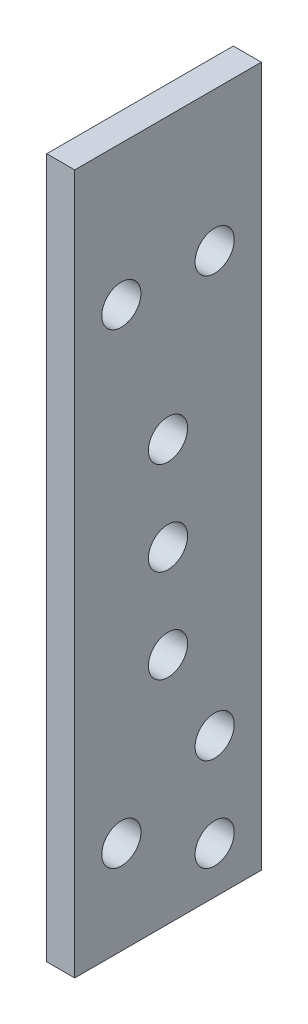
ISO-10303-21;
HEADER;
FILE_DESCRIPTION(('STEP AP214'),'2;1');
FILE_NAME('part.step','',(''),(''),'','','');
FILE_SCHEMA(('AUTOMOTIVE_DESIGN { 1 0 10303 214 1 1 1 1 }'));
ENDSEC;
DATA;
#1=APPLICATION_CONTEXT('core data for automotive mechanical design processes');
#2=APPLICATION_PROTOCOL_DEFINITION('international standard','automotive_design',2000,#1);
#3=PRODUCT_CONTEXT('',#1,'mechanical');
#4=PRODUCT('Part','Part','',(#3));
#5=PRODUCT_RELATED_PRODUCT_CATEGORY('part','',(#4));
#6=PRODUCT_DEFINITION_FORMATION('','',#4);
#7=PRODUCT_DEFINITION_CONTEXT('part definition',#1,'design');
#8=PRODUCT_DEFINITION('design','',#6,#7);
#9=PRODUCT_DEFINITION_SHAPE('','',#8);
#10=(LENGTH_UNIT() NAMED_UNIT(*) SI_UNIT(.MILLI.,.METRE.));
#11=(NAMED_UNIT(*) PLANE_ANGLE_UNIT() SI_UNIT($,.RADIAN.));
#12=(NAMED_UNIT(*) SI_UNIT($,.STERADIAN.) SOLID_ANGLE_UNIT());
#13=UNCERTAINTY_MEASURE_WITH_UNIT(LENGTH_MEASURE(1.E-05),#10,'distance_accuracy_value','');
#14=(GEOMETRIC_REPRESENTATION_CONTEXT(3) GLOBAL_UNCERTAINTY_ASSIGNED_CONTEXT((#13)) GLOBAL_UNIT_ASSIGNED_CONTEXT((#10,
#11,#12)) REPRESENTATION_CONTEXT('',''));
#15=CARTESIAN_POINT('',(0.,0.,0.));
#16=DIRECTION('',(0.,0.,1.));
#17=DIRECTION('',(1.,0.,0.));
#18=AXIS2_PLACEMENT_3D('',#15,#16,#17);
#19=CARTESIAN_POINT('',(39.,-80.,20.));
#20=DIRECTION('',(0.,0.,1.));
#21=DIRECTION('',(1.,0.,0.));
#22=AXIS2_PLACEMENT_3D('',#19,#20,#21);
#23=PLANE('',#22);
#24=DIRECTION('',(0.,1.,0.));
#25=VECTOR('',#24,1.);
#26=CARTESIAN_POINT('',(36.,-80.,20.));
#27=LINE('',#26,#25);
#28=CARTESIAN_POINT('',(36.,-80.,20.));
#29=VERTEX_POINT('',#28);
#30=CARTESIAN_POINT('',(36.,-5.00000000000002,20.));
#31=VERTEX_POINT('',#30);
#32=EDGE_CURVE('E97',#29,#31,#27,.T.);
#33=ORIENTED_EDGE('',*,*,#32,.F.);
#34=DIRECTION('',(-1.,0.,0.));
#35=VECTOR('',#34,1.);
#36=CARTESIAN_POINT('',(39.,-80.,20.));
#37=LINE('',#36,#35);
#38=CARTESIAN_POINT('',(39.,-80.,20.));
#39=VERTEX_POINT('',#38);
#40=EDGE_CURVE('E11',#39,#29,#37,.T.);
#41=ORIENTED_EDGE('',*,*,#40,.F.);
#42=DIRECTION('',(0.,1.,0.));
#43=VECTOR('',#42,1.);
#44=CARTESIAN_POINT('',(39.,-80.,20.));
#45=LINE('',#44,#43);
#46=CARTESIAN_POINT('',(39.,-5.00000000000002,20.));
#47=VERTEX_POINT('',#46);
#48=EDGE_CURVE('E90',#39,#47,#45,.T.);
#49=ORIENTED_EDGE('',*,*,#48,.T.);
#50=DIRECTION('',(-1.,0.,0.));
#51=VECTOR('',#50,1.);
#52=CARTESIAN_POINT('',(39.,-5.00000000000002,20.));
#53=LINE('',#52,#51);
#54=EDGE_CURVE('E35',#47,#31,#53,.T.);
#55=ORIENTED_EDGE('',*,*,#54,.T.);
#56=EDGE_LOOP('',(#33,#41,#49,#55));
#57=FACE_BOUND('',#56,.T.);
#58=ADVANCED_FACE('F32',(#57),#23,.T.);
#59=CARTESIAN_POINT('',(39.,-80.,0.));
#60=DIRECTION('',(0.,-1.,0.));
#61=DIRECTION('',(0.,0.,-1.));
#62=AXIS2_PLACEMENT_3D('',#59,#60,#61);
#63=PLANE('',#62);
#64=DIRECTION('',(0.,0.,1.));
#65=VECTOR('',#64,1.);
#66=CARTESIAN_POINT('',(36.,-80.,0.));
#67=LINE('',#66,#65);
#68=CARTESIAN_POINT('',(36.,-80.,0.));
#69=VERTEX_POINT('',#68);
#70=EDGE_CURVE('E92',#69,#29,#67,.T.);
#71=ORIENTED_EDGE('',*,*,#70,.F.);
#72=DIRECTION('',(-1.,0.,0.));
#73=VECTOR('',#72,1.);
#74=CARTESIAN_POINT('',(39.,-80.,0.));
#75=LINE('',#74,#73);
#76=CARTESIAN_POINT('',(39.,-80.,0.));
#77=VERTEX_POINT('',#76);
#78=EDGE_CURVE('E41',#77,#69,#75,.T.);
#79=ORIENTED_EDGE('',*,*,#78,.F.);
#80=DIRECTION('',(0.,0.,1.));
#81=VECTOR('',#80,1.);
#82=CARTESIAN_POINT('',(39.,-80.,0.));
#83=LINE('',#82,#81);
#84=EDGE_CURVE('E87',#77,#39,#83,.T.);
#85=ORIENTED_EDGE('',*,*,#84,.T.);
#86=ORIENTED_EDGE('',*,*,#40,.T.);
#87=EDGE_LOOP('',(#71,#79,#85,#86));
#88=FACE_BOUND('',#87,.T.);
#89=ADVANCED_FACE('F108',(#88),#63,.T.);
#90=CARTESIAN_POINT('',(39.,-5.00000000000002,0.));
#91=DIRECTION('',(0.,0.,-1.));
#92=DIRECTION('',(0.,1.,0.));
#93=AXIS2_PLACEMENT_3D('',#90,#91,#92);
#94=PLANE('',#93);
#95=DIRECTION('',(0.,-1.,0.));
#96=VECTOR('',#95,1.);
#97=CARTESIAN_POINT('',(36.,-5.00000000000002,0.));
#98=LINE('',#97,#96);
#99=CARTESIAN_POINT('',(36.,-5.00000000000002,0.));
#100=VERTEX_POINT('',#99);
#101=EDGE_CURVE('E82',#100,#69,#98,.T.);
#102=ORIENTED_EDGE('',*,*,#101,.F.);
#103=DIRECTION('',(-1.,0.,0.));
#104=VECTOR('',#103,1.);
#105=CARTESIAN_POINT('',(39.,-5.00000000000002,0.));
#106=LINE('',#105,#104);
#107=CARTESIAN_POINT('',(39.,-5.00000000000002,0.));
#108=VERTEX_POINT('',#107);
#109=EDGE_CURVE('E77',#108,#100,#106,.T.);
#110=ORIENTED_EDGE('',*,*,#109,.F.);
#111=DIRECTION('',(0.,-1.,0.));
#112=VECTOR('',#111,1.);
#113=CARTESIAN_POINT('',(39.,-5.00000000000002,0.));
#114=LINE('',#113,#112);
#115=EDGE_CURVE('E80',#108,#77,#114,.T.);
#116=ORIENTED_EDGE('',*,*,#115,.T.);
#117=ORIENTED_EDGE('',*,*,#78,.T.);
#118=EDGE_LOOP('',(#102,#110,#116,#117));
#119=FACE_BOUND('',#118,.T.);
#120=ADVANCED_FACE('F79',(#119),#94,.T.);
#121=CARTESIAN_POINT('',(39.,-5.00000000000002,20.));
#122=DIRECTION('',(0.,1.,0.));
#123=DIRECTION('',(0.,0.,1.));
#124=AXIS2_PLACEMENT_3D('',#121,#122,#123);
#125=PLANE('',#124);
#126=DIRECTION('',(0.,0.,-1.));
#127=VECTOR('',#126,1.);
#128=CARTESIAN_POINT('',(36.,-5.00000000000002,20.));
#129=LINE('',#128,#127);
#130=EDGE_CURVE('E100',#31,#100,#129,.T.);
#131=ORIENTED_EDGE('',*,*,#130,.F.);
#132=ORIENTED_EDGE('',*,*,#54,.F.);
#133=DIRECTION('',(0.,0.,-1.));
#134=VECTOR('',#133,1.);
#135=CARTESIAN_POINT('',(39.,-5.00000000000002,20.));
#136=LINE('',#135,#134);
#137=EDGE_CURVE('E86',#47,#108,#136,.T.);
#138=ORIENTED_EDGE('',*,*,#137,.T.);
#139=ORIENTED_EDGE('',*,*,#109,.T.);
#140=EDGE_LOOP('',(#131,#132,#138,#139));
#141=FACE_BOUND('',#140,.T.);
#142=ADVANCED_FACE('F89',(#141),#125,.T.);
#143=CARTESIAN_POINT('',(39.,0.,0.));
#144=DIRECTION('',(-1.,0.,0.));
#145=DIRECTION('',(0.,0.,1.));
#146=AXIS2_PLACEMENT_3D('',#143,#144,#145);
#147=PLANE('',#146);
#148=CARTESIAN_POINT('',(39.,-65.,5.00000000000002));
#149=DIRECTION('',(-1.,0.,0.));
#150=DIRECTION('',(0.,0.,-1.));
#151=AXIS2_PLACEMENT_3D('',#148,#149,#150);
#152=CIRCLE('',#151,2.1);
#153=CARTESIAN_POINT('',(39.,-65.,2.90000000000002));
#154=VERTEX_POINT('',#153);
#155=EDGE_CURVE('E165',#154,#154,#152,.T.);
#156=ORIENTED_EDGE('',*,*,#155,.T.);
#157=EDGE_LOOP('',(#156));
#158=FACE_BOUND('',#157,.T.);
#159=CARTESIAN_POINT('',(39.,-70.,15.));
#160=DIRECTION('',(-1.,0.,0.));
#161=DIRECTION('',(0.,0.,-1.));
#162=AXIS2_PLACEMENT_3D('',#159,#160,#161);
#163=CIRCLE('',#162,2.1);
#164=CARTESIAN_POINT('',(39.,-70.,12.9));
#165=VERTEX_POINT('',#164);
#166=EDGE_CURVE('E173',#165,#165,#163,.T.);
#167=ORIENTED_EDGE('',*,*,#166,.T.);
#168=EDGE_LOOP('',(#167));
#169=FACE_BOUND('',#168,.T.);
#170=CARTESIAN_POINT('',(39.,-75.,5.00000000000002));
#171=DIRECTION('',(-1.,0.,0.));
#172=DIRECTION('',(0.,0.,-1.));
#173=AXIS2_PLACEMENT_3D('',#170,#171,#172);
#174=CIRCLE('',#173,2.1);
#175=CARTESIAN_POINT('',(39.,-75.,2.90000000000002));
#176=VERTEX_POINT('',#175);
#177=EDGE_CURVE('E179',#176,#176,#174,.T.);
#178=ORIENTED_EDGE('',*,*,#177,.T.);
#179=EDGE_LOOP('',(#178));
#180=FACE_BOUND('',#179,.T.);
#181=CARTESIAN_POINT('',(39.,-20.,5.00000000000003));
#182=DIRECTION('',(-1.,0.,0.));
#183=DIRECTION('',(0.,0.,-1.));
#184=AXIS2_PLACEMENT_3D('',#181,#182,#183);
#185=CIRCLE('',#184,2.1);
#186=CARTESIAN_POINT('',(39.,-20.,2.90000000000003));
#187=VERTEX_POINT('',#186);
#188=EDGE_CURVE('E185',#187,#187,#185,.T.);
#189=ORIENTED_EDGE('',*,*,#188,.T.);
#190=EDGE_LOOP('',(#189));
#191=FACE_BOUND('',#190,.T.);
#192=CARTESIAN_POINT('',(39.,-35.,10.));
#193=DIRECTION('',(-1.,0.,0.));
#194=DIRECTION('',(0.,0.,-1.));
#195=AXIS2_PLACEMENT_3D('',#192,#193,#194);
#196=CIRCLE('',#195,2.1);
#197=CARTESIAN_POINT('',(39.,-35.,7.9));
#198=VERTEX_POINT('',#197);
#199=EDGE_CURVE('E191',#198,#198,#196,.T.);
#200=ORIENTED_EDGE('',*,*,#199,.T.);
#201=EDGE_LOOP('',(#200));
#202=FACE_BOUND('',#201,.T.);
#203=CARTESIAN_POINT('',(39.,-45.,10.));
#204=DIRECTION('',(-1.,0.,0.));
#205=DIRECTION('',(0.,0.,-1.));
#206=AXIS2_PLACEMENT_3D('',#203,#204,#205);
#207=CIRCLE('',#206,2.1);
#208=CARTESIAN_POINT('',(39.,-45.,7.9));
#209=VERTEX_POINT('',#208);
#210=EDGE_CURVE('E197',#209,#209,#207,.T.);
#211=ORIENTED_EDGE('',*,*,#210,.T.);
#212=EDGE_LOOP('',(#211));
#213=FACE_BOUND('',#212,.T.);
#214=CARTESIAN_POINT('',(39.,-55.,10.));
#215=DIRECTION('',(-1.,0.,0.));
#216=DIRECTION('',(0.,0.,-1.));
#217=AXIS2_PLACEMENT_3D('',#214,#215,#216);
#218=CIRCLE('',#217,2.1);
#219=CARTESIAN_POINT('',(39.,-55.,7.9));
#220=VERTEX_POINT('',#219);
#221=EDGE_CURVE('E203',#220,#220,#218,.T.);
#222=ORIENTED_EDGE('',*,*,#221,.T.);
#223=EDGE_LOOP('',(#222));
#224=FACE_BOUND('',#223,.T.);
#225=CARTESIAN_POINT('',(39.,-20.,15.));
#226=DIRECTION('',(-1.,0.,0.));
#227=DIRECTION('',(0.,0.,-1.));
#228=AXIS2_PLACEMENT_3D('',#225,#226,#227);
#229=CIRCLE('',#228,2.1);
#230=CARTESIAN_POINT('',(39.,-20.,12.9));
#231=VERTEX_POINT('',#230);
#232=EDGE_CURVE('E101',#231,#231,#229,.T.);
#233=ORIENTED_EDGE('',*,*,#232,.T.);
#234=EDGE_LOOP('',(#233));
#235=FACE_BOUND('',#234,.T.);
#236=ORIENTED_EDGE('',*,*,#48,.F.);
#237=ORIENTED_EDGE('',*,*,#84,.F.);
#238=ORIENTED_EDGE('',*,*,#115,.F.);
#239=ORIENTED_EDGE('',*,*,#137,.F.);
#240=EDGE_LOOP('',(#236,#237,#238,#239));
#241=FACE_BOUND('',#240,.T.);
#242=ADVANCED_FACE('F85',(#158,#169,#180,#191,#202,#213,#224,#235,#241),#147,.F.);
#243=CARTESIAN_POINT('',(36.,0.,0.));
#244=DIRECTION('',(-1.,0.,0.));
#245=DIRECTION('',(0.,0.,1.));
#246=AXIS2_PLACEMENT_3D('',#243,#244,#245);
#247=PLANE('',#246);
#248=CARTESIAN_POINT('',(36.,-65.,5.00000000000002));
#249=DIRECTION('',(-1.,0.,0.));
#250=DIRECTION('',(0.,0.,-1.));
#251=AXIS2_PLACEMENT_3D('',#248,#249,#250);
#252=CIRCLE('',#251,2.1);
#253=CARTESIAN_POINT('',(36.,-65.,2.90000000000002));
#254=VERTEX_POINT('',#253);
#255=EDGE_CURVE('E168',#254,#254,#252,.T.);
#256=ORIENTED_EDGE('',*,*,#255,.F.);
#257=EDGE_LOOP('',(#256));
#258=FACE_BOUND('',#257,.T.);
#259=CARTESIAN_POINT('',(36.,-70.,15.));
#260=DIRECTION('',(-1.,0.,0.));
#261=DIRECTION('',(0.,0.,-1.));
#262=AXIS2_PLACEMENT_3D('',#259,#260,#261);
#263=CIRCLE('',#262,2.1);
#264=CARTESIAN_POINT('',(36.,-70.,12.9));
#265=VERTEX_POINT('',#264);
#266=EDGE_CURVE('E170',#265,#265,#263,.T.);
#267=ORIENTED_EDGE('',*,*,#266,.F.);
#268=EDGE_LOOP('',(#267));
#269=FACE_BOUND('',#268,.T.);
#270=CARTESIAN_POINT('',(36.,-75.,5.00000000000002));
#271=DIRECTION('',(-1.,0.,0.));
#272=DIRECTION('',(0.,0.,-1.));
#273=AXIS2_PLACEMENT_3D('',#270,#271,#272);
#274=CIRCLE('',#273,2.1);
#275=CARTESIAN_POINT('',(36.,-75.,2.90000000000002));
#276=VERTEX_POINT('',#275);
#277=EDGE_CURVE('E176',#276,#276,#274,.T.);
#278=ORIENTED_EDGE('',*,*,#277,.F.);
#279=EDGE_LOOP('',(#278));
#280=FACE_BOUND('',#279,.T.);
#281=CARTESIAN_POINT('',(36.,-20.,5.00000000000003));
#282=DIRECTION('',(-1.,0.,0.));
#283=DIRECTION('',(0.,0.,-1.));
#284=AXIS2_PLACEMENT_3D('',#281,#282,#283);
#285=CIRCLE('',#284,2.1);
#286=CARTESIAN_POINT('',(36.,-20.,2.90000000000003));
#287=VERTEX_POINT('',#286);
#288=EDGE_CURVE('E182',#287,#287,#285,.T.);
#289=ORIENTED_EDGE('',*,*,#288,.F.);
#290=EDGE_LOOP('',(#289));
#291=FACE_BOUND('',#290,.T.);
#292=CARTESIAN_POINT('',(36.,-35.,10.));
#293=DIRECTION('',(-1.,0.,0.));
#294=DIRECTION('',(0.,0.,-1.));
#295=AXIS2_PLACEMENT_3D('',#292,#293,#294);
#296=CIRCLE('',#295,2.1);
#297=CARTESIAN_POINT('',(36.,-35.,7.9));
#298=VERTEX_POINT('',#297);
#299=EDGE_CURVE('E188',#298,#298,#296,.T.);
#300=ORIENTED_EDGE('',*,*,#299,.F.);
#301=EDGE_LOOP('',(#300));
#302=FACE_BOUND('',#301,.T.);
#303=CARTESIAN_POINT('',(36.,-45.,10.));
#304=DIRECTION('',(-1.,0.,0.));
#305=DIRECTION('',(0.,0.,-1.));
#306=AXIS2_PLACEMENT_3D('',#303,#304,#305);
#307=CIRCLE('',#306,2.1);
#308=CARTESIAN_POINT('',(36.,-45.,7.9));
#309=VERTEX_POINT('',#308);
#310=EDGE_CURVE('E194',#309,#309,#307,.T.);
#311=ORIENTED_EDGE('',*,*,#310,.F.);
#312=EDGE_LOOP('',(#311));
#313=FACE_BOUND('',#312,.T.);
#314=CARTESIAN_POINT('',(36.,-55.,10.));
#315=DIRECTION('',(-1.,0.,0.));
#316=DIRECTION('',(0.,0.,-1.));
#317=AXIS2_PLACEMENT_3D('',#314,#315,#316);
#318=CIRCLE('',#317,2.1);
#319=CARTESIAN_POINT('',(36.,-55.,7.9));
#320=VERTEX_POINT('',#319);
#321=EDGE_CURVE('E200',#320,#320,#318,.T.);
#322=ORIENTED_EDGE('',*,*,#321,.F.);
#323=EDGE_LOOP('',(#322));
#324=FACE_BOUND('',#323,.T.);
#325=CARTESIAN_POINT('',(36.,-20.,15.));
#326=DIRECTION('',(-1.,0.,0.));
#327=DIRECTION('',(0.,0.,-1.));
#328=AXIS2_PLACEMENT_3D('',#325,#326,#327);
#329=CIRCLE('',#328,2.1);
#330=CARTESIAN_POINT('',(36.,-20.,12.9));
#331=VERTEX_POINT('',#330);
#332=EDGE_CURVE('E206',#331,#331,#329,.T.);
#333=ORIENTED_EDGE('',*,*,#332,.F.);
#334=EDGE_LOOP('',(#333));
#335=FACE_BOUND('',#334,.T.);
#336=ORIENTED_EDGE('',*,*,#32,.T.);
#337=ORIENTED_EDGE('',*,*,#130,.T.);
#338=ORIENTED_EDGE('',*,*,#101,.T.);
#339=ORIENTED_EDGE('',*,*,#70,.T.);
#340=EDGE_LOOP('',(#336,#337,#338,#339));
#341=FACE_BOUND('',#340,.T.);
#342=ADVANCED_FACE('F107',(#258,#269,#280,#291,#302,#313,#324,#335,#341),#247,.T.);
#343=CARTESIAN_POINT('',(39.,-20.,15.));
#344=DIRECTION('',(-1.,0.,0.));
#345=DIRECTION('',(0.,0.,1.));
#346=AXIS2_PLACEMENT_3D('',#343,#344,#345);
#347=CYLINDRICAL_SURFACE('',#346,2.1);
#348=ORIENTED_EDGE('',*,*,#232,.F.);
#349=EDGE_LOOP('',(#348));
#350=FACE_BOUND('',#349,.T.);
#351=ORIENTED_EDGE('',*,*,#332,.T.);
#352=EDGE_LOOP('',(#351));
#353=FACE_BOUND('',#352,.T.);
#354=ADVANCED_FACE('F126',(#350,#353),#347,.F.);
#355=CARTESIAN_POINT('',(39.,-55.,10.));
#356=DIRECTION('',(-1.,0.,0.));
#357=DIRECTION('',(0.,0.,1.));
#358=AXIS2_PLACEMENT_3D('',#355,#356,#357);
#359=CYLINDRICAL_SURFACE('',#358,2.1);
#360=ORIENTED_EDGE('',*,*,#221,.F.);
#361=EDGE_LOOP('',(#360));
#362=FACE_BOUND('',#361,.T.);
#363=ORIENTED_EDGE('',*,*,#321,.T.);
#364=EDGE_LOOP('',(#363));
#365=FACE_BOUND('',#364,.T.);
#366=ADVANCED_FACE('F133',(#362,#365),#359,.F.);
#367=CARTESIAN_POINT('',(39.,-45.,10.));
#368=DIRECTION('',(-1.,0.,0.));
#369=DIRECTION('',(0.,0.,1.));
#370=AXIS2_PLACEMENT_3D('',#367,#368,#369);
#371=CYLINDRICAL_SURFACE('',#370,2.1);
#372=ORIENTED_EDGE('',*,*,#210,.F.);
#373=EDGE_LOOP('',(#372));
#374=FACE_BOUND('',#373,.T.);
#375=ORIENTED_EDGE('',*,*,#310,.T.);
#376=EDGE_LOOP('',(#375));
#377=FACE_BOUND('',#376,.T.);
#378=ADVANCED_FACE('F137',(#374,#377),#371,.F.);
#379=CARTESIAN_POINT('',(39.,-35.,10.));
#380=DIRECTION('',(-1.,0.,0.));
#381=DIRECTION('',(0.,0.,1.));
#382=AXIS2_PLACEMENT_3D('',#379,#380,#381);
#383=CYLINDRICAL_SURFACE('',#382,2.1);
#384=ORIENTED_EDGE('',*,*,#199,.F.);
#385=EDGE_LOOP('',(#384));
#386=FACE_BOUND('',#385,.T.);
#387=ORIENTED_EDGE('',*,*,#299,.T.);
#388=EDGE_LOOP('',(#387));
#389=FACE_BOUND('',#388,.T.);
#390=ADVANCED_FACE('F141',(#386,#389),#383,.F.);
#391=CARTESIAN_POINT('',(39.,-20.,5.00000000000003));
#392=DIRECTION('',(-1.,0.,0.));
#393=DIRECTION('',(0.,0.,1.));
#394=AXIS2_PLACEMENT_3D('',#391,#392,#393);
#395=CYLINDRICAL_SURFACE('',#394,2.1);
#396=ORIENTED_EDGE('',*,*,#188,.F.);
#397=EDGE_LOOP('',(#396));
#398=FACE_BOUND('',#397,.T.);
#399=ORIENTED_EDGE('',*,*,#288,.T.);
#400=EDGE_LOOP('',(#399));
#401=FACE_BOUND('',#400,.T.);
#402=ADVANCED_FACE('F145',(#398,#401),#395,.F.);
#403=CARTESIAN_POINT('',(39.,-75.,5.00000000000002));
#404=DIRECTION('',(-1.,0.,0.));
#405=DIRECTION('',(0.,0.,1.));
#406=AXIS2_PLACEMENT_3D('',#403,#404,#405);
#407=CYLINDRICAL_SURFACE('',#406,2.1);
#408=ORIENTED_EDGE('',*,*,#177,.F.);
#409=EDGE_LOOP('',(#408));
#410=FACE_BOUND('',#409,.T.);
#411=ORIENTED_EDGE('',*,*,#277,.T.);
#412=EDGE_LOOP('',(#411));
#413=FACE_BOUND('',#412,.T.);
#414=ADVANCED_FACE('F149',(#410,#413),#407,.F.);
#415=CARTESIAN_POINT('',(39.,-70.,15.));
#416=DIRECTION('',(-1.,0.,0.));
#417=DIRECTION('',(0.,0.,1.));
#418=AXIS2_PLACEMENT_3D('',#415,#416,#417);
#419=CYLINDRICAL_SURFACE('',#418,2.1);
#420=ORIENTED_EDGE('',*,*,#166,.F.);
#421=EDGE_LOOP('',(#420));
#422=FACE_BOUND('',#421,.T.);
#423=ORIENTED_EDGE('',*,*,#266,.T.);
#424=EDGE_LOOP('',(#423));
#425=FACE_BOUND('',#424,.T.);
#426=ADVANCED_FACE('F153',(#422,#425),#419,.F.);
#427=CARTESIAN_POINT('',(39.,-65.,5.00000000000002));
#428=DIRECTION('',(-1.,0.,0.));
#429=DIRECTION('',(0.,0.,1.));
#430=AXIS2_PLACEMENT_3D('',#427,#428,#429);
#431=CYLINDRICAL_SURFACE('',#430,2.1);
#432=ORIENTED_EDGE('',*,*,#155,.F.);
#433=EDGE_LOOP('',(#432));
#434=FACE_BOUND('',#433,.T.);
#435=ORIENTED_EDGE('',*,*,#255,.T.);
#436=EDGE_LOOP('',(#435));
#437=FACE_BOUND('',#436,.T.);
#438=ADVANCED_FACE('F157',(#434,#437),#431,.F.);
#439=CLOSED_SHELL('',(#58,#89,#120,#142,#242,#342,#354,#366,#378,#390,#402,#414,#426,#438));
#440=MANIFOLD_SOLID_BREP('B2',#439);
#441=ADVANCED_BREP_SHAPE_REPRESENTATION('',(#18,#440),#14);
#442=SHAPE_DEFINITION_REPRESENTATION(#9,#441);
ENDSEC;
END-ISO-10303-21;
